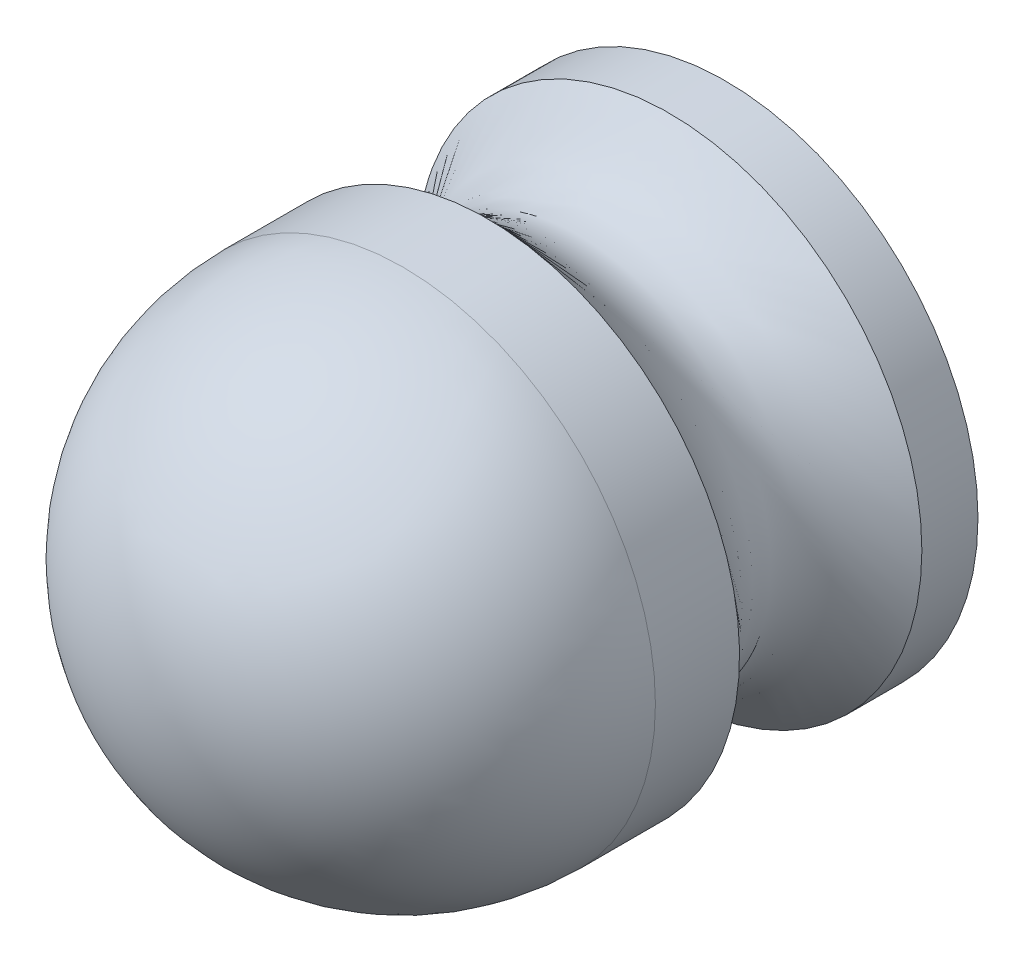
ISO-10303-21;
HEADER;
FILE_DESCRIPTION(('STEP AP214'),'2;1');
FILE_NAME('part.step','',(''),(''),'','','');
FILE_SCHEMA(('AUTOMOTIVE_DESIGN { 1 0 10303 214 1 1 1 1 }'));
ENDSEC;
DATA;
#1=APPLICATION_CONTEXT('core data for automotive mechanical design processes');
#2=APPLICATION_PROTOCOL_DEFINITION('international standard','automotive_design',2000,#1);
#3=PRODUCT_CONTEXT('',#1,'mechanical');
#4=PRODUCT('Part','Part','',(#3));
#5=PRODUCT_RELATED_PRODUCT_CATEGORY('part','',(#4));
#6=PRODUCT_DEFINITION_FORMATION('','',#4);
#7=PRODUCT_DEFINITION_CONTEXT('part definition',#1,'design');
#8=PRODUCT_DEFINITION('design','',#6,#7);
#9=PRODUCT_DEFINITION_SHAPE('','',#8);
#10=(LENGTH_UNIT() NAMED_UNIT(*) SI_UNIT(.MILLI.,.METRE.));
#11=(NAMED_UNIT(*) PLANE_ANGLE_UNIT() SI_UNIT($,.RADIAN.));
#12=(NAMED_UNIT(*) SI_UNIT($,.STERADIAN.) SOLID_ANGLE_UNIT());
#13=UNCERTAINTY_MEASURE_WITH_UNIT(LENGTH_MEASURE(1.E-05),#10,'distance_accuracy_value','');
#14=(GEOMETRIC_REPRESENTATION_CONTEXT(3) GLOBAL_UNCERTAINTY_ASSIGNED_CONTEXT((#13)) GLOBAL_UNIT_ASSIGNED_CONTEXT((#10,
#11,#12)) REPRESENTATION_CONTEXT('',''));
#15=CARTESIAN_POINT('',(0.,0.,0.));
#16=DIRECTION('',(0.,0.,1.));
#17=DIRECTION('',(1.,0.,0.));
#18=AXIS2_PLACEMENT_3D('',#15,#16,#17);
#19=CARTESIAN_POINT('',(0.,-23.0426916360591,0.));
#20=DIRECTION('',(0.,0.,1.));
#21=DIRECTION('',(1.,0.,0.));
#22=AXIS2_PLACEMENT_3D('',#19,#20,#21);
#23=PLANE('',#22);
#24=CARTESIAN_POINT('',(0.,-23.0426916360591,0.));
#25=DIRECTION('',(0.,0.,1.));
#26=DIRECTION('',(1.,0.,0.));
#27=AXIS2_PLACEMENT_3D('',#24,#25,#26);
#28=CIRCLE('',#27,9.);
#29=CARTESIAN_POINT('',(8.99999999999999,-23.0426916360591,0.));
#30=VERTEX_POINT('',#29);
#31=EDGE_CURVE('E44',#30,#30,#28,.T.);
#32=ORIENTED_EDGE('',*,*,#31,.F.);
#33=EDGE_LOOP('',(#32));
#34=FACE_BOUND('',#33,.T.);
#35=CARTESIAN_POINT('',(0.,-23.0426916360591,0.));
#36=DIRECTION('',(0.,0.,1.));
#37=DIRECTION('',(1.,0.,0.));
#38=AXIS2_PLACEMENT_3D('',#35,#36,#37);
#39=CIRCLE('',#38,1.5);
#40=CARTESIAN_POINT('',(1.5,-23.0426916360591,0.));
#41=VERTEX_POINT('',#40);
#42=EDGE_CURVE('E49',#41,#41,#39,.T.);
#43=ORIENTED_EDGE('',*,*,#42,.T.);
#44=EDGE_LOOP('',(#43));
#45=FACE_BOUND('',#44,.T.);
#46=ADVANCED_FACE('F33',(#34,#45),#23,.F.);
#47=CARTESIAN_POINT('',(0.,-23.0426916360591,2.));
#48=DIRECTION('',(0.,0.,-1.));
#49=DIRECTION('',(-1.,0.,0.));
#50=AXIS2_PLACEMENT_3D('',#47,#48,#49);
#51=CYLINDRICAL_SURFACE('',#50,9.);
#52=CARTESIAN_POINT('',(0.,-23.0426916360591,2.));
#53=DIRECTION('',(0.,0.,1.));
#54=DIRECTION('',(1.,0.,0.));
#55=AXIS2_PLACEMENT_3D('',#52,#53,#54);
#56=CIRCLE('',#55,9.);
#57=CARTESIAN_POINT('',(8.99999999999999,-23.0426916360591,2.));
#58=VERTEX_POINT('',#57);
#59=EDGE_CURVE('E40',#58,#58,#56,.T.);
#60=ORIENTED_EDGE('',*,*,#59,.F.);
#61=EDGE_LOOP('',(#60));
#62=FACE_BOUND('',#61,.T.);
#63=ORIENTED_EDGE('',*,*,#31,.T.);
#64=EDGE_LOOP('',(#63));
#65=FACE_BOUND('',#64,.T.);
#66=ADVANCED_FACE('F77',(#62,#65),#51,.T.);
#67=CARTESIAN_POINT('',(0.,-23.0426916360591,2.));
#68=DIRECTION('',(0.,0.,-1.));
#69=DIRECTION('',(-1.,0.,0.));
#70=AXIS2_PLACEMENT_3D('',#67,#68,#69);
#71=CYLINDRICAL_SURFACE('',#70,1.5);
#72=CARTESIAN_POINT('',(0.,-23.0426916360591,2.));
#73=DIRECTION('',(0.,0.,1.));
#74=DIRECTION('',(1.,0.,0.));
#75=AXIS2_PLACEMENT_3D('',#72,#73,#74);
#76=CIRCLE('',#75,1.5);
#77=CARTESIAN_POINT('',(1.5,-23.0426916360591,2.));
#78=VERTEX_POINT('',#77);
#79=EDGE_CURVE('E53',#78,#78,#76,.T.);
#80=ORIENTED_EDGE('',*,*,#79,.T.);
#81=EDGE_LOOP('',(#80));
#82=FACE_BOUND('',#81,.T.);
#83=ORIENTED_EDGE('',*,*,#42,.F.);
#84=EDGE_LOOP('',(#83));
#85=FACE_BOUND('',#84,.T.);
#86=ADVANCED_FACE('F71',(#82,#85),#71,.F.);
#87=CARTESIAN_POINT('',(0.,-23.0426916360591,2.));
#88=DIRECTION('',(0.,0.,1.));
#89=DIRECTION('',(1.,0.,0.));
#90=AXIS2_PLACEMENT_3D('',#87,#88,#89);
#91=PLANE('',#90);
#92=ORIENTED_EDGE('',*,*,#79,.F.);
#93=EDGE_LOOP('',(#92));
#94=FACE_BOUND('',#93,.T.);
#95=ADVANCED_FACE('F64',(#94),#91,.F.);
#96=CARTESIAN_POINT('',(8.99999999999999,-23.0426916360591,2.));
#97=CARTESIAN_POINT('',(1.46373448675395,-14.1625181381883,8.5));
#98=CARTESIAN_POINT('',(8.99999999999999,-5.04269163605907,2.));
#99=CARTESIAN_POINT('',(-16.2966125089877,-11.2350491646803,8.5));
#100=CARTESIAN_POINT('',(-9.,-5.04269163605907,2.));
#101=CARTESIAN_POINT('',(-19.2240814824956,-28.995396160422,8.5));
#102=CARTESIAN_POINT('',(-9.00000000000001,-23.0426916360591,2.));
#103=CARTESIAN_POINT('',(-1.46373448675396,-31.9228651339299,8.5));
#104=CARTESIAN_POINT('',(-9.00000000000001,-41.0426916360591,2.));
#105=CARTESIAN_POINT('',(16.2966125089877,-34.8503341074378,8.5));
#106=CARTESIAN_POINT('',(8.99999999999999,-41.0426916360591,2.));
#107=CARTESIAN_POINT('',(19.2240814824956,-17.0899871116962,8.5));
#108=CARTESIAN_POINT('',(8.99999999999999,-23.0426916360591,2.));
#109=CARTESIAN_POINT('',(1.46373448675395,-14.1625181381883,8.5));
#110=(BOUNDED_SURFACE() B_SPLINE_SURFACE(3,1,((#96,#97),(#98,#99),(#100,#101),(#102,#103),(#104,
#105),(#106,#107),(#108,#109)),.UNSPECIFIED.,.T.,.F.,.F.) B_SPLINE_SURFACE_WITH_KNOTS((4,3,4),
(2,2),(0.,0.5,1.),(0.,1.),
.UNSPECIFIED.) GEOMETRIC_REPRESENTATION_ITEM() RATIONAL_B_SPLINE_SURFACE(((1.,1.),
(0.333333333333333,0.333333333333334),(0.333333333333333,0.333333333333334),(1.,1.),
(0.333333333333333,0.333333333333333),(0.333333333333333,0.333333333333333),(1.,1.))) REPRESENTATION_ITEM('') SURFACE());
#111=CARTESIAN_POINT('',(0.,-23.0426916360591,8.5));
#112=DIRECTION('',(0.,0.,1.));
#113=DIRECTION('',(1.,0.,0.));
#114=AXIS2_PLACEMENT_3D('',#111,#112,#113);
#115=CIRCLE('',#114,9.);
#116=CARTESIAN_POINT('',(1.46373448675395,-14.1625181381883,8.5));
#117=VERTEX_POINT('',#116);
#118=EDGE_CURVE('E56',#117,#117,#115,.T.);
#119=CARTESIAN_POINT('',(8.99999999999999,-23.0426916360591,2.));
#120=CARTESIAN_POINT('',(8.92149723423702,-22.9501898287896,2.06770833333333));
#121=CARTESIAN_POINT('',(8.84299446847404,-22.8576880215201,2.13541666666667));
#122=CARTESIAN_POINT('',(8.68598893694807,-22.6726844069811,2.27083333333333));
#123=CARTESIAN_POINT('',(8.60748617118509,-22.5801825997116,2.33854166666667));
#124=CARTESIAN_POINT('',(8.45048063965914,-22.3951789851727,2.47395833333333));
#125=CARTESIAN_POINT('',(8.37197787389616,-22.3026771779032,2.54166666666667));
#126=CARTESIAN_POINT('',(8.2149723423702,-22.1176735633642,2.67708333333333));
#127=CARTESIAN_POINT('',(8.13646957660722,-22.0251717560947,2.74479166666667));
#128=CARTESIAN_POINT('',(7.97946404508126,-21.8401681415557,2.88020833333333));
#129=CARTESIAN_POINT('',(7.90096127931828,-21.7476663342862,2.94791666666667));
#130=CARTESIAN_POINT('',(7.74395574779232,-21.5626627197473,3.08333333333333));
#131=CARTESIAN_POINT('',(7.66545298202934,-21.4701609124778,3.15104166666667));
#132=CARTESIAN_POINT('',(7.50844745050338,-21.2851572979388,3.28645833333333));
#133=CARTESIAN_POINT('',(7.4299446847404,-21.1926554906693,3.35416666666667));
#134=CARTESIAN_POINT('',(7.27293915321444,-21.0076518761303,3.48958333333333));
#135=CARTESIAN_POINT('',(7.19443638745146,-20.9151500688609,3.55729166666667));
#136=CARTESIAN_POINT('',(7.0374308559255,-20.7301464543219,3.69270833333333));
#137=CARTESIAN_POINT('',(6.95892809016252,-20.6376446470524,3.76041666666667));
#138=CARTESIAN_POINT('',(6.80192255863656,-20.4526410325134,3.89583333333333));
#139=CARTESIAN_POINT('',(6.72341979287358,-20.3601392252439,3.96354166666667));
#140=CARTESIAN_POINT('',(6.56641426134763,-20.1751356107049,4.09895833333333));
#141=CARTESIAN_POINT('',(6.48791149558465,-20.0826338034355,4.16666666666667));
#142=CARTESIAN_POINT('',(6.33090596405869,-19.8976301888965,4.30208333333333));
#143=CARTESIAN_POINT('',(6.25240319829571,-19.805128381627,4.36979166666667));
#144=CARTESIAN_POINT('',(6.09539766676975,-19.620124767088,4.50520833333333));
#145=CARTESIAN_POINT('',(6.01689490100677,-19.5276229598185,4.57291666666667));
#146=CARTESIAN_POINT('',(5.85988936948081,-19.3426193452796,4.70833333333333));
#147=CARTESIAN_POINT('',(5.78138660371783,-19.2501175380101,4.77604166666667));
#148=CARTESIAN_POINT('',(5.62438107219187,-19.0651139234711,4.91145833333333));
#149=CARTESIAN_POINT('',(5.54587830642889,-18.9726121162016,4.97916666666667));
#150=CARTESIAN_POINT('',(5.38887277490293,-18.7876085016626,5.11458333333333));
#151=CARTESIAN_POINT('',(5.31037000913995,-18.6951066943931,5.18229166666667));
#152=CARTESIAN_POINT('',(5.15336447761399,-18.5101030798542,5.31770833333333));
#153=CARTESIAN_POINT('',(5.07486171185101,-18.4176012725847,5.38541666666667));
#154=CARTESIAN_POINT('',(4.91785618032505,-18.2325976580457,5.52083333333333));
#155=CARTESIAN_POINT('',(4.83935341456207,-18.1400958507762,5.58854166666667));
#156=CARTESIAN_POINT('',(4.68234788303611,-17.9550922362372,5.72395833333333));
#157=CARTESIAN_POINT('',(4.60384511727313,-17.8625904289678,5.79166666666667));
#158=CARTESIAN_POINT('',(4.44683958574717,-17.6775868144288,5.92708333333333));
#159=CARTESIAN_POINT('',(4.36833681998419,-17.5850850071593,5.99479166666667));
#160=CARTESIAN_POINT('',(4.21133128845824,-17.4000813926203,6.13020833333333));
#161=CARTESIAN_POINT('',(4.13282852269526,-17.3075795853508,6.19791666666667));
#162=CARTESIAN_POINT('',(3.9758229911693,-17.1225759708119,6.33333333333333));
#163=CARTESIAN_POINT('',(3.89732022540632,-17.0300741635424,6.40104166666667));
#164=CARTESIAN_POINT('',(3.74031469388036,-16.8450705490034,6.53645833333333));
#165=CARTESIAN_POINT('',(3.66181192811738,-16.7525687417339,6.60416666666667));
#166=CARTESIAN_POINT('',(3.50480639659142,-16.5675651271949,6.73958333333333));
#167=CARTESIAN_POINT('',(3.42630363082844,-16.4750633199254,6.80729166666667));
#168=CARTESIAN_POINT('',(3.26929809930248,-16.2900597053865,6.94270833333333));
#169=CARTESIAN_POINT('',(3.1907953335395,-16.197557898117,7.01041666666667));
#170=CARTESIAN_POINT('',(3.03378980201354,-16.012554283578,7.14583333333333));
#171=CARTESIAN_POINT('',(2.95528703625056,-15.9200524763085,7.21354166666667));
#172=CARTESIAN_POINT('',(2.7982815047246,-15.7350488617695,7.34895833333333));
#173=CARTESIAN_POINT('',(2.71977873896162,-15.6425470545001,7.41666666666667));
#174=CARTESIAN_POINT('',(2.56277320743566,-15.4575434399611,7.55208333333333));
#175=CARTESIAN_POINT('',(2.48427044167268,-15.3650416326916,7.61979166666667));
#176=CARTESIAN_POINT('',(2.32726491014672,-15.1800380181526,7.75520833333333));
#177=CARTESIAN_POINT('',(2.24876214438375,-15.0875362108831,7.82291666666667));
#178=CARTESIAN_POINT('',(2.09175661285779,-14.9025325963442,7.95833333333333));
#179=CARTESIAN_POINT('',(2.01325384709481,-14.8100307890747,8.02604166666667));
#180=CARTESIAN_POINT('',(1.85624831556885,-14.6250271745357,8.16145833333333));
#181=CARTESIAN_POINT('',(1.77774554980587,-14.5325253672662,8.22916666666667));
#182=CARTESIAN_POINT('',(1.62074001827991,-14.3475217527272,8.36458333333333));
#183=CARTESIAN_POINT('',(1.54223725251693,-14.2550199454577,8.43229166666667));
#184=CARTESIAN_POINT('',(1.46373448675395,-14.1625181381883,8.5));
#185=B_SPLINE_CURVE_WITH_KNOTS('',3,(#119,#120,#121,#122,#123,#124,#125,#126,#127,#128,#129,
#130,#131,#132,#133,#134,#135,#136,#137,#138,#139,#140,#141,#142,#143,#144,#145,#146,#147,#148,
#149,#150,#151,#152,#153,#154,#155,#156,#157,#158,#159,#160,#161,#162,#163,#164,#165,#166,#167,
#168,#169,#170,#171,#172,#173,#174,#175,#176,#177,#178,#179,#180,#181,#182,#183,#184),
.UNSPECIFIED.,.F.,.F.,(4,2,2,2,2,2,2,2,2,2,2,2,2,2,2,2,2,2,2,2,2,2,2,2,2,2,2,2,2,2,2,2,4),(0.,
0.416813127012608,0.833626254025215,1.25043938103782,1.66725250805043,2.08406563506304,
2.50087876207564,2.91769188908825,3.33450501610086,3.75131814311347,4.16813127012608,
4.58494439713868,5.00175752415129,5.4185706511639,5.83538377817651,6.25219690518912,
6.66901003220172,7.08582315921433,7.50263628622694,7.91944941323954,8.33626254025215,
8.75307566726476,9.16988879427737,9.58670192128998,10.0035150483026,10.4203281753152,
10.8371413023278,11.2539544293404,11.670767556353,12.0875806833656,12.5043938103782,
12.9212069373908,13.3380200644034),.UNSPECIFIED.);
#186=EDGE_CURVE('BSEAM62',#58,#117,#185,.T.);
#187=ORIENTED_EDGE('',*,*,#59,.T.);
#188=ORIENTED_EDGE('',*,*,#118,.F.);
#189=ORIENTED_EDGE('',*,*,#186,.T.);
#190=ORIENTED_EDGE('',*,*,#186,.F.);
#191=EDGE_LOOP('',(#187,#189,#188,#190));
#192=FACE_BOUND('',#191,.T.);
#193=ADVANCED_FACE('F62',(#192),#110,.T.);
#194=CARTESIAN_POINT('',(0.,-23.0426916360591,20.5));
#195=DIRECTION('',(0.,0.,-1.));
#196=DIRECTION('',(-1.,0.,0.));
#197=AXIS2_PLACEMENT_3D('',#194,#195,#196);
#198=CYLINDRICAL_SURFACE('',#197,9.);
#199=CARTESIAN_POINT('',(0.,-23.0426916360591,11.5));
#200=DIRECTION('',(0.,0.,-1.));
#201=DIRECTION('',(-1.,0.,0.));
#202=AXIS2_PLACEMENT_3D('',#199,#200,#201);
#203=CIRCLE('',#202,9.);
#204=CARTESIAN_POINT('',(-9.00000000000001,-23.0426916360591,11.5));
#205=VERTEX_POINT('',#204);
#206=EDGE_CURVE('E11',#205,#205,#203,.T.);
#207=ORIENTED_EDGE('',*,*,#206,.T.);
#208=EDGE_LOOP('',(#207));
#209=FACE_BOUND('',#208,.T.);
#210=ORIENTED_EDGE('',*,*,#118,.T.);
#211=EDGE_LOOP('',(#210));
#212=FACE_BOUND('',#211,.T.);
#213=ADVANCED_FACE('F60',(#209,#212),#198,.T.);
#214=CARTESIAN_POINT('',(0.,-23.0426916360591,11.5));
#215=DIRECTION('',(0.,0.,1.));
#216=DIRECTION('',(1.,0.,0.));
#217=AXIS2_PLACEMENT_3D('',#214,#215,#216);
#218=SPHERICAL_SURFACE('',#217,9.);
#219=ORIENTED_EDGE('',*,*,#206,.F.);
#220=EDGE_LOOP('',(#219));
#221=FACE_BOUND('',#220,.T.);
#222=ADVANCED_FACE('F35',(#221),#218,.T.);
#223=CLOSED_SHELL('',(#46,#66,#86,#95,#193,#213,#222));
#224=MANIFOLD_SOLID_BREP('B2',#223);
#225=ADVANCED_BREP_SHAPE_REPRESENTATION('',(#18,#224),#14);
#226=SHAPE_DEFINITION_REPRESENTATION(#9,#225);
ENDSEC;
END-ISO-10303-21;
